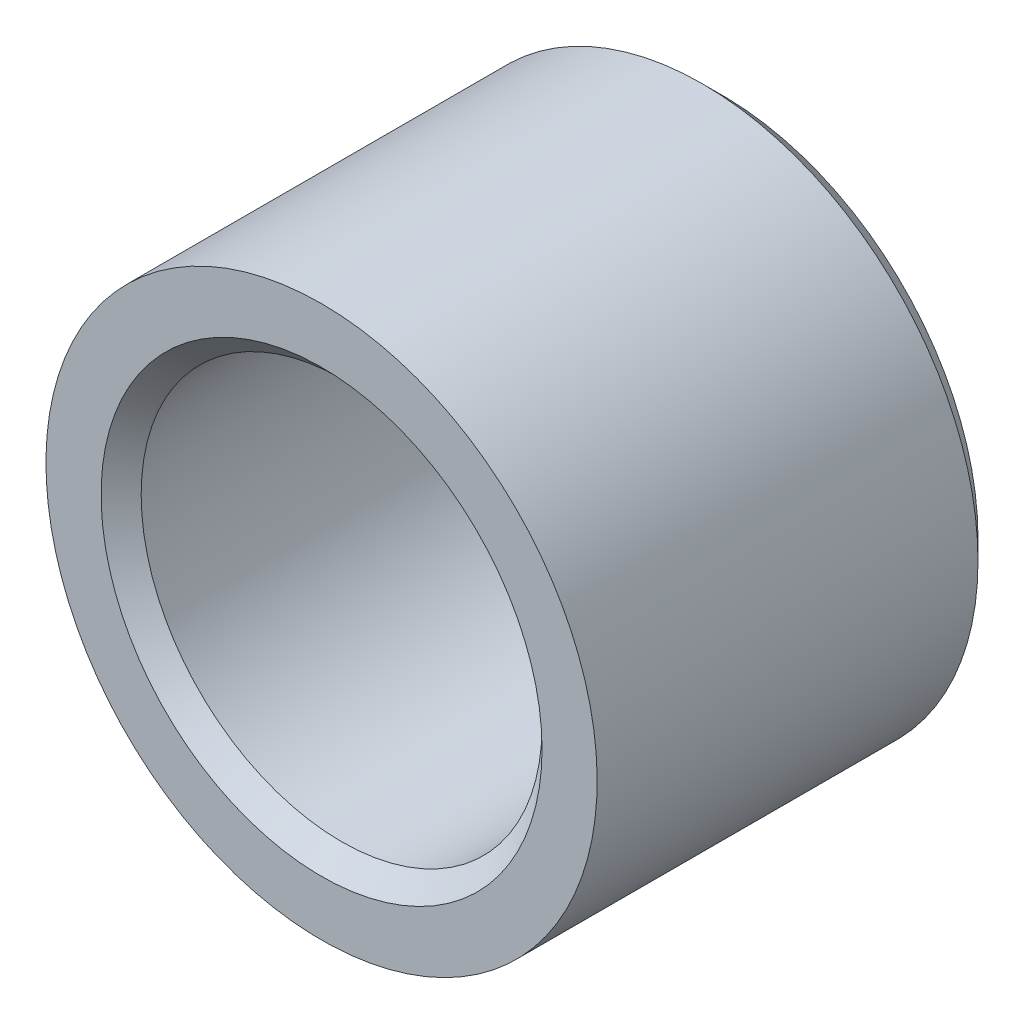
ISO-10303-21;
HEADER;
FILE_DESCRIPTION(('STEP AP214'),'2;1');
FILE_NAME('part.step','',(''),(''),'','','');
FILE_SCHEMA(('AUTOMOTIVE_DESIGN { 1 0 10303 214 1 1 1 1 }'));
ENDSEC;
DATA;
#1=APPLICATION_CONTEXT('core data for automotive mechanical design processes');
#2=APPLICATION_PROTOCOL_DEFINITION('international standard','automotive_design',2000,#1);
#3=PRODUCT_CONTEXT('',#1,'mechanical');
#4=PRODUCT('Part','Part','',(#3));
#5=PRODUCT_RELATED_PRODUCT_CATEGORY('part','',(#4));
#6=PRODUCT_DEFINITION_FORMATION('','',#4);
#7=PRODUCT_DEFINITION_CONTEXT('part definition',#1,'design');
#8=PRODUCT_DEFINITION('design','',#6,#7);
#9=PRODUCT_DEFINITION_SHAPE('','',#8);
#10=(LENGTH_UNIT() NAMED_UNIT(*) SI_UNIT(.MILLI.,.METRE.));
#11=(NAMED_UNIT(*) PLANE_ANGLE_UNIT() SI_UNIT($,.RADIAN.));
#12=(NAMED_UNIT(*) SI_UNIT($,.STERADIAN.) SOLID_ANGLE_UNIT());
#13=UNCERTAINTY_MEASURE_WITH_UNIT(LENGTH_MEASURE(1.E-05),#10,'distance_accuracy_value','');
#14=(GEOMETRIC_REPRESENTATION_CONTEXT(3) GLOBAL_UNCERTAINTY_ASSIGNED_CONTEXT((#13)) GLOBAL_UNIT_ASSIGNED_CONTEXT((#10,
#11,#12)) REPRESENTATION_CONTEXT('',''));
#15=CARTESIAN_POINT('',(0.,0.,0.));
#16=DIRECTION('',(0.,0.,1.));
#17=DIRECTION('',(1.,0.,0.));
#18=AXIS2_PLACEMENT_3D('',#15,#16,#17);
#19=CARTESIAN_POINT('',(0.,0.,4.));
#20=DIRECTION('',(0.,0.,-1.));
#21=DIRECTION('',(0.,1.,0.));
#22=AXIS2_PLACEMENT_3D('',#19,#20,#21);
#23=CYLINDRICAL_SURFACE('',#22,2.);
#24=CARTESIAN_POINT('',(0.,0.,0.));
#25=DIRECTION('',(0.,0.,-1.));
#26=DIRECTION('',(0.,1.,0.));
#27=AXIS2_PLACEMENT_3D('',#24,#25,#26);
#28=CIRCLE('',#27,2.);
#29=CARTESIAN_POINT('',(0.,2.,0.));
#30=VERTEX_POINT('',#29);
#31=EDGE_CURVE('E19',#30,#30,#28,.T.);
#32=ORIENTED_EDGE('',*,*,#31,.T.);
#33=EDGE_LOOP('',(#32));
#34=FACE_BOUND('',#33,.T.);
#35=CARTESIAN_POINT('',(0.,0.,3.80000000001246));
#36=DIRECTION('',(0.,0.,1.));
#37=DIRECTION('',(0.,-1.,0.));
#38=AXIS2_PLACEMENT_3D('',#35,#36,#37);
#39=CIRCLE('',#38,2.00000000000955);
#40=CARTESIAN_POINT('',(0.,-2.00000000000955,3.80000000001246));
#41=VERTEX_POINT('',#40);
#42=EDGE_CURVE('E33',#41,#41,#39,.T.);
#43=ORIENTED_EDGE('',*,*,#42,.T.);
#44=EDGE_LOOP('',(#43));
#45=FACE_BOUND('',#44,.T.);
#46=ADVANCED_FACE('F16',(#34,#45),#23,.F.);
#47=CARTESIAN_POINT('',(0.,0.,3.99999999996226));
#48=DIRECTION('',(0.,0.,1.));
#49=DIRECTION('',(1.,0.,0.));
#50=AXIS2_PLACEMENT_3D('',#47,#48,#49);
#51=CONICAL_SURFACE('',#50,2.19999999995935,0.785398163397448);
#52=ORIENTED_EDGE('',*,*,#42,.F.);
#53=EDGE_LOOP('',(#52));
#54=FACE_BOUND('',#53,.T.);
#55=CARTESIAN_POINT('',(0.,0.,3.99999999996226));
#56=DIRECTION('',(0.,0.,1.));
#57=DIRECTION('',(1.,0.,0.));
#58=AXIS2_PLACEMENT_3D('',#55,#56,#57);
#59=CIRCLE('',#58,2.19999999995935);
#60=CARTESIAN_POINT('',(2.19999999995935,0.,3.99999999996226));
#61=VERTEX_POINT('',#60);
#62=EDGE_CURVE('E37',#61,#61,#59,.F.);
#63=ORIENTED_EDGE('',*,*,#62,.F.);
#64=EDGE_LOOP('',(#63));
#65=FACE_BOUND('',#64,.T.);
#66=ADVANCED_FACE('F50',(#54,#65),#51,.F.);
#67=CARTESIAN_POINT('',(0.,0.,0.));
#68=DIRECTION('',(0.,0.,1.));
#69=DIRECTION('',(0.,-1.,0.));
#70=AXIS2_PLACEMENT_3D('',#67,#68,#69);
#71=PLANE('',#70);
#72=ORIENTED_EDGE('',*,*,#31,.F.);
#73=EDGE_LOOP('',(#72));
#74=FACE_BOUND('',#73,.T.);
#75=CARTESIAN_POINT('',(0.,0.,0.));
#76=DIRECTION('',(0.,0.,1.));
#77=DIRECTION('',(1.,0.,0.));
#78=AXIS2_PLACEMENT_3D('',#75,#76,#77);
#79=CIRCLE('',#78,2.55000000004202);
#80=CARTESIAN_POINT('',(2.55000000004202,0.,0.));
#81=VERTEX_POINT('',#80);
#82=EDGE_CURVE('E28',#81,#81,#79,.T.);
#83=ORIENTED_EDGE('',*,*,#82,.F.);
#84=EDGE_LOOP('',(#83));
#85=FACE_BOUND('',#84,.T.);
#86=ADVANCED_FACE('F46',(#74,#85),#71,.F.);
#87=CARTESIAN_POINT('',(0.,0.,4.));
#88=DIRECTION('',(0.,0.,1.));
#89=DIRECTION('',(0.,-1.,0.));
#90=AXIS2_PLACEMENT_3D('',#87,#88,#89);
#91=PLANE('',#90);
#92=CARTESIAN_POINT('',(0.,0.,4.));
#93=DIRECTION('',(0.,0.,-1.));
#94=DIRECTION('',(0.,1.,0.));
#95=AXIS2_PLACEMENT_3D('',#92,#93,#94);
#96=CIRCLE('',#95,2.75);
#97=CARTESIAN_POINT('',(0.,2.75,4.));
#98=VERTEX_POINT('',#97);
#99=EDGE_CURVE('E23',#98,#98,#96,.T.);
#100=ORIENTED_EDGE('',*,*,#99,.F.);
#101=EDGE_LOOP('',(#100));
#102=FACE_BOUND('',#101,.T.);
#103=ORIENTED_EDGE('',*,*,#62,.T.);
#104=EDGE_LOOP('',(#103));
#105=FACE_BOUND('',#104,.T.);
#106=ADVANCED_FACE('F49',(#102,#105),#91,.T.);
#107=CARTESIAN_POINT('',(0.,0.,0.199999999892952));
#108=DIRECTION('',(0.,0.,1.));
#109=DIRECTION('',(1.,0.,0.));
#110=AXIS2_PLACEMENT_3D('',#107,#108,#109);
#111=CONICAL_SURFACE('',#110,2.74999999987813,0.78539816325534);
#112=ORIENTED_EDGE('',*,*,#82,.T.);
#113=EDGE_LOOP('',(#112));
#114=FACE_BOUND('',#113,.T.);
#115=CARTESIAN_POINT('',(0.,0.,0.2));
#116=DIRECTION('',(0.,0.,-1.));
#117=DIRECTION('',(0.,1.,0.));
#118=AXIS2_PLACEMENT_3D('',#115,#116,#117);
#119=CIRCLE('',#118,2.75);
#120=CARTESIAN_POINT('',(0.,2.75,0.2));
#121=VERTEX_POINT('',#120);
#122=EDGE_CURVE('E10',#121,#121,#119,.F.);
#123=ORIENTED_EDGE('',*,*,#122,.F.);
#124=EDGE_LOOP('',(#123));
#125=FACE_BOUND('',#124,.T.);
#126=ADVANCED_FACE('F54',(#114,#125),#111,.T.);
#127=CARTESIAN_POINT('',(0.,0.,4.));
#128=DIRECTION('',(0.,0.,-1.));
#129=DIRECTION('',(0.,1.,0.));
#130=AXIS2_PLACEMENT_3D('',#127,#128,#129);
#131=CYLINDRICAL_SURFACE('',#130,2.75);
#132=ORIENTED_EDGE('',*,*,#122,.T.);
#133=EDGE_LOOP('',(#132));
#134=FACE_BOUND('',#133,.T.);
#135=ORIENTED_EDGE('',*,*,#99,.T.);
#136=EDGE_LOOP('',(#135));
#137=FACE_BOUND('',#136,.T.);
#138=ADVANCED_FACE('F57',(#134,#137),#131,.T.);
#139=CLOSED_SHELL('',(#46,#66,#86,#106,#126,#138));
#140=MANIFOLD_SOLID_BREP('B1',#139);
#141=ADVANCED_BREP_SHAPE_REPRESENTATION('',(#18,#140),#14);
#142=SHAPE_DEFINITION_REPRESENTATION(#9,#141);
ENDSEC;
END-ISO-10303-21;
